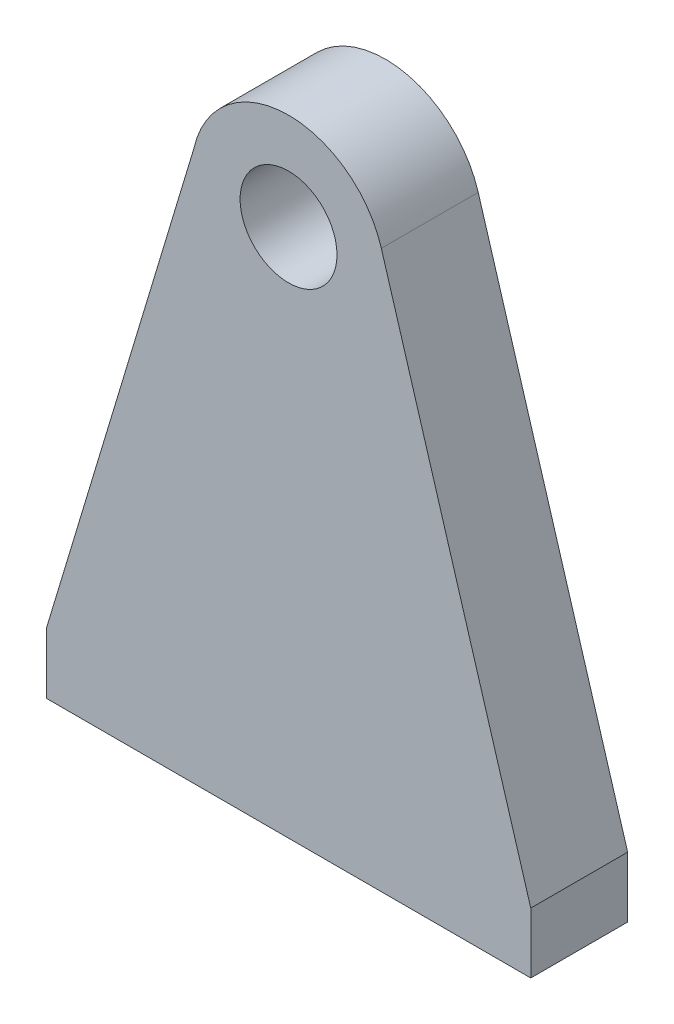
ISO-10303-21;
HEADER;
FILE_DESCRIPTION(('STEP AP214'),'2;1');
FILE_NAME('part.step','',(''),(''),'','','');
FILE_SCHEMA(('AUTOMOTIVE_DESIGN { 1 0 10303 214 1 1 1 1 }'));
ENDSEC;
DATA;
#1=APPLICATION_CONTEXT('core data for automotive mechanical design processes');
#2=APPLICATION_PROTOCOL_DEFINITION('international standard','automotive_design',2000,#1);
#3=PRODUCT_CONTEXT('',#1,'mechanical');
#4=PRODUCT('Part','Part','',(#3));
#5=PRODUCT_RELATED_PRODUCT_CATEGORY('part','',(#4));
#6=PRODUCT_DEFINITION_FORMATION('','',#4);
#7=PRODUCT_DEFINITION_CONTEXT('part definition',#1,'design');
#8=PRODUCT_DEFINITION('design','',#6,#7);
#9=PRODUCT_DEFINITION_SHAPE('','',#8);
#10=(LENGTH_UNIT() NAMED_UNIT(*) SI_UNIT(.MILLI.,.METRE.));
#11=(NAMED_UNIT(*) PLANE_ANGLE_UNIT() SI_UNIT($,.RADIAN.));
#12=(NAMED_UNIT(*) SI_UNIT($,.STERADIAN.) SOLID_ANGLE_UNIT());
#13=UNCERTAINTY_MEASURE_WITH_UNIT(LENGTH_MEASURE(1.E-05),#10,'distance_accuracy_value','');
#14=(GEOMETRIC_REPRESENTATION_CONTEXT(3) GLOBAL_UNCERTAINTY_ASSIGNED_CONTEXT((#13)) GLOBAL_UNIT_ASSIGNED_CONTEXT((#10,
#11,#12)) REPRESENTATION_CONTEXT('',''));
#15=CARTESIAN_POINT('',(0.,0.,0.));
#16=DIRECTION('',(0.,0.,1.));
#17=DIRECTION('',(1.,0.,0.));
#18=AXIS2_PLACEMENT_3D('',#15,#16,#17);
#19=CARTESIAN_POINT('',(-16.5786983985875,216.11316607204,40.));
#20=DIRECTION('',(0.,0.,1.));
#21=DIRECTION('',(1.,0.,0.));
#22=AXIS2_PLACEMENT_3D('',#19,#20,#21);
#23=PLANE('',#22);
#24=DIRECTION('',(-0.288644962462309,-0.957436204477944,0.));
#25=VECTOR('',#24,1.);
#26=CARTESIAN_POINT('',(-55.6490102421352,224.687006078008,40.));
#27=LINE('',#26,#25);
#28=CARTESIAN_POINT('',(-55.6490102421352,224.687006078008,40.));
#29=VERTEX_POINT('',#28);
#30=CARTESIAN_POINT('',(-116.578698398587,22.583048084437,40.));
#31=VERTEX_POINT('',#30);
#32=EDGE_CURVE('E146',#29,#31,#27,.T.);
#33=ORIENTED_EDGE('',*,*,#32,.T.);
#34=DIRECTION('',(0.,-1.,0.));
#35=VECTOR('',#34,1.);
#36=CARTESIAN_POINT('',(-116.578698398587,22.583048084437,40.));
#37=LINE('',#36,#35);
#38=CARTESIAN_POINT('',(-116.578698398587,-2.41695191556296,40.));
#39=VERTEX_POINT('',#38);
#40=EDGE_CURVE('E94',#31,#39,#37,.T.);
#41=ORIENTED_EDGE('',*,*,#40,.T.);
#42=DIRECTION('',(1.,0.,0.));
#43=VECTOR('',#42,1.);
#44=CARTESIAN_POINT('',(-116.578698398587,-2.41695191556296,40.));
#45=LINE('',#44,#43);
#46=CARTESIAN_POINT('',(83.4213016014125,-2.41695191556296,40.));
#47=VERTEX_POINT('',#46);
#48=EDGE_CURVE('E107',#39,#47,#45,.T.);
#49=ORIENTED_EDGE('',*,*,#48,.T.);
#50=DIRECTION('',(0.,1.,0.));
#51=VECTOR('',#50,1.);
#52=CARTESIAN_POINT('',(83.4213016014125,22.583048084437,40.));
#53=LINE('',#52,#51);
#54=CARTESIAN_POINT('',(83.4213016014125,22.583048084437,40.));
#55=VERTEX_POINT('',#54);
#56=EDGE_CURVE('E101',#47,#55,#53,.T.);
#57=ORIENTED_EDGE('',*,*,#56,.T.);
#58=DIRECTION('',(-0.28811791414262,0.957594939183633,0.));
#59=VECTOR('',#58,1.);
#60=CARTESIAN_POINT('',(21.7250991687578,227.637882637745,40.));
#61=LINE('',#60,#59);
#62=CARTESIAN_POINT('',(21.7250991687578,227.637882637745,40.));
#63=VERTEX_POINT('',#62);
#64=EDGE_CURVE('E105',#55,#63,#61,.T.);
#65=ORIENTED_EDGE('',*,*,#64,.T.);
#66=CARTESIAN_POINT('',(-16.5786983985875,216.11316607204,40.));
#67=DIRECTION('',(0.,0.,1.));
#68=DIRECTION('',(1.,0.,0.));
#69=AXIS2_PLACEMENT_3D('',#66,#67,#68);
#70=CIRCLE('',#69,40.);
#71=EDGE_CURVE('E57',#63,#29,#70,.T.);
#72=ORIENTED_EDGE('',*,*,#71,.T.);
#73=EDGE_LOOP('',(#33,#41,#49,#57,#65,#72));
#74=FACE_BOUND('',#73,.T.);
#75=CARTESIAN_POINT('',(-16.5786983985875,216.11316607204,40.));
#76=DIRECTION('',(0.,0.,1.));
#77=DIRECTION('',(1.,0.,0.));
#78=AXIS2_PLACEMENT_3D('',#75,#76,#77);
#79=CIRCLE('',#78,20.);
#80=CARTESIAN_POINT('',(3.4213016014125,216.11316607204,40.));
#81=VERTEX_POINT('',#80);
#82=EDGE_CURVE('E134',#81,#81,#79,.T.);
#83=ORIENTED_EDGE('',*,*,#82,.F.);
#84=EDGE_LOOP('',(#83));
#85=FACE_BOUND('',#84,.T.);
#86=ADVANCED_FACE('F39',(#74,#85),#23,.T.);
#87=CARTESIAN_POINT('',(-16.5786983985875,216.11316607204,0.));
#88=DIRECTION('',(0.,0.,1.));
#89=DIRECTION('',(1.,0.,0.));
#90=AXIS2_PLACEMENT_3D('',#87,#88,#89);
#91=PLANE('',#90);
#92=DIRECTION('',(-0.288644962462309,-0.957436204477944,0.));
#93=VECTOR('',#92,1.);
#94=CARTESIAN_POINT('',(-55.6490102421352,224.687006078008,0.));
#95=LINE('',#94,#93);
#96=CARTESIAN_POINT('',(-55.6490102421352,224.687006078008,0.));
#97=VERTEX_POINT('',#96);
#98=CARTESIAN_POINT('',(-116.578698398587,22.583048084437,0.));
#99=VERTEX_POINT('',#98);
#100=EDGE_CURVE('E129',#97,#99,#95,.T.);
#101=ORIENTED_EDGE('',*,*,#100,.F.);
#102=CARTESIAN_POINT('',(-16.5786983985875,216.11316607204,0.));
#103=DIRECTION('',(0.,0.,1.));
#104=DIRECTION('',(1.,0.,0.));
#105=AXIS2_PLACEMENT_3D('',#102,#103,#104);
#106=CIRCLE('',#105,40.);
#107=CARTESIAN_POINT('',(21.7250991687578,227.637882637745,0.));
#108=VERTEX_POINT('',#107);
#109=EDGE_CURVE('E86',#108,#97,#106,.T.);
#110=ORIENTED_EDGE('',*,*,#109,.F.);
#111=DIRECTION('',(-0.28811791414262,0.957594939183633,0.));
#112=VECTOR('',#111,1.);
#113=CARTESIAN_POINT('',(21.7250991687578,227.637882637745,0.));
#114=LINE('',#113,#112);
#115=CARTESIAN_POINT('',(83.4213016014125,22.583048084437,0.));
#116=VERTEX_POINT('',#115);
#117=EDGE_CURVE('E80',#116,#108,#114,.T.);
#118=ORIENTED_EDGE('',*,*,#117,.F.);
#119=DIRECTION('',(0.,1.,0.));
#120=VECTOR('',#119,1.);
#121=CARTESIAN_POINT('',(83.4213016014125,22.583048084437,0.));
#122=LINE('',#121,#120);
#123=CARTESIAN_POINT('',(83.4213016014125,-2.41695191556296,0.));
#124=VERTEX_POINT('',#123);
#125=EDGE_CURVE('E116',#124,#116,#122,.T.);
#126=ORIENTED_EDGE('',*,*,#125,.F.);
#127=DIRECTION('',(1.,0.,0.));
#128=VECTOR('',#127,1.);
#129=CARTESIAN_POINT('',(-116.578698398587,-2.41695191556296,0.));
#130=LINE('',#129,#128);
#131=CARTESIAN_POINT('',(-116.578698398587,-2.41695191556296,0.));
#132=VERTEX_POINT('',#131);
#133=EDGE_CURVE('E137',#132,#124,#130,.T.);
#134=ORIENTED_EDGE('',*,*,#133,.F.);
#135=DIRECTION('',(0.,-1.,0.));
#136=VECTOR('',#135,1.);
#137=CARTESIAN_POINT('',(-116.578698398587,22.583048084437,0.));
#138=LINE('',#137,#136);
#139=EDGE_CURVE('E133',#99,#132,#138,.T.);
#140=ORIENTED_EDGE('',*,*,#139,.F.);
#141=EDGE_LOOP('',(#101,#110,#118,#126,#134,#140));
#142=FACE_BOUND('',#141,.T.);
#143=CARTESIAN_POINT('',(-16.5786983985875,216.11316607204,0.));
#144=DIRECTION('',(0.,0.,1.));
#145=DIRECTION('',(1.,0.,0.));
#146=AXIS2_PLACEMENT_3D('',#143,#144,#145);
#147=CIRCLE('',#146,20.);
#148=CARTESIAN_POINT('',(3.4213016014125,216.11316607204,0.));
#149=VERTEX_POINT('',#148);
#150=EDGE_CURVE('E243',#149,#149,#147,.T.);
#151=ORIENTED_EDGE('',*,*,#150,.T.);
#152=EDGE_LOOP('',(#151));
#153=FACE_BOUND('',#152,.T.);
#154=ADVANCED_FACE('F159',(#142,#153),#91,.F.);
#155=CARTESIAN_POINT('',(-55.6490102421352,224.687006078008,40.));
#156=DIRECTION('',(0.957436204477944,-0.288644962462309,0.));
#157=DIRECTION('',(0.288644962462309,0.957436204477944,0.));
#158=AXIS2_PLACEMENT_3D('',#155,#156,#157);
#159=PLANE('',#158);
#160=ORIENTED_EDGE('',*,*,#100,.T.);
#161=DIRECTION('',(0.,0.,-1.));
#162=VECTOR('',#161,1.);
#163=CARTESIAN_POINT('',(-116.578698398587,22.583048084437,40.));
#164=LINE('',#163,#162);
#165=EDGE_CURVE('E11',#31,#99,#164,.T.);
#166=ORIENTED_EDGE('',*,*,#165,.F.);
#167=ORIENTED_EDGE('',*,*,#32,.F.);
#168=DIRECTION('',(0.,0.,-1.));
#169=VECTOR('',#168,1.);
#170=CARTESIAN_POINT('',(-55.6490102421352,224.687006078008,40.));
#171=LINE('',#170,#169);
#172=EDGE_CURVE('E125',#29,#97,#171,.T.);
#173=ORIENTED_EDGE('',*,*,#172,.T.);
#174=EDGE_LOOP('',(#160,#166,#167,#173));
#175=FACE_BOUND('',#174,.T.);
#176=ADVANCED_FACE('F41',(#175),#159,.F.);
#177=CARTESIAN_POINT('',(-116.578698398587,22.583048084437,40.));
#178=DIRECTION('',(1.,0.,0.));
#179=DIRECTION('',(0.,0.,-1.));
#180=AXIS2_PLACEMENT_3D('',#177,#178,#179);
#181=PLANE('',#180);
#182=ORIENTED_EDGE('',*,*,#139,.T.);
#183=DIRECTION('',(0.,0.,-1.));
#184=VECTOR('',#183,1.);
#185=CARTESIAN_POINT('',(-116.578698398587,-2.41695191556296,40.));
#186=LINE('',#185,#184);
#187=EDGE_CURVE('E49',#39,#132,#186,.T.);
#188=ORIENTED_EDGE('',*,*,#187,.F.);
#189=ORIENTED_EDGE('',*,*,#40,.F.);
#190=ORIENTED_EDGE('',*,*,#165,.T.);
#191=EDGE_LOOP('',(#182,#188,#189,#190));
#192=FACE_BOUND('',#191,.T.);
#193=ADVANCED_FACE('F184',(#192),#181,.F.);
#194=CARTESIAN_POINT('',(-116.578698398587,-2.41695191556296,40.));
#195=DIRECTION('',(0.,1.,0.));
#196=DIRECTION('',(0.,0.,1.));
#197=AXIS2_PLACEMENT_3D('',#194,#195,#196);
#198=PLANE('',#197);
#199=ORIENTED_EDGE('',*,*,#133,.T.);
#200=DIRECTION('',(0.,0.,-1.));
#201=VECTOR('',#200,1.);
#202=CARTESIAN_POINT('',(83.4213016014125,-2.41695191556296,40.));
#203=LINE('',#202,#201);
#204=EDGE_CURVE('E118',#47,#124,#203,.T.);
#205=ORIENTED_EDGE('',*,*,#204,.F.);
#206=ORIENTED_EDGE('',*,*,#48,.F.);
#207=ORIENTED_EDGE('',*,*,#187,.T.);
#208=EDGE_LOOP('',(#199,#205,#206,#207));
#209=FACE_BOUND('',#208,.T.);
#210=ADVANCED_FACE('F156',(#209),#198,.F.);
#211=CARTESIAN_POINT('',(83.4213016014125,22.583048084437,40.));
#212=DIRECTION('',(-1.,0.,0.));
#213=DIRECTION('',(0.,0.,1.));
#214=AXIS2_PLACEMENT_3D('',#211,#212,#213);
#215=PLANE('',#214);
#216=ORIENTED_EDGE('',*,*,#125,.T.);
#217=DIRECTION('',(0.,0.,-1.));
#218=VECTOR('',#217,1.);
#219=CARTESIAN_POINT('',(83.4213016014125,22.583048084437,40.));
#220=LINE('',#219,#218);
#221=EDGE_CURVE('E113',#55,#116,#220,.T.);
#222=ORIENTED_EDGE('',*,*,#221,.F.);
#223=ORIENTED_EDGE('',*,*,#56,.F.);
#224=ORIENTED_EDGE('',*,*,#204,.T.);
#225=EDGE_LOOP('',(#216,#222,#223,#224));
#226=FACE_BOUND('',#225,.T.);
#227=ADVANCED_FACE('F114',(#226),#215,.F.);
#228=CARTESIAN_POINT('',(21.7250991687578,227.637882637745,40.));
#229=DIRECTION('',(-0.957594939183633,-0.28811791414262,0.));
#230=DIRECTION('',(0.28811791414262,-0.957594939183633,0.));
#231=AXIS2_PLACEMENT_3D('',#228,#229,#230);
#232=PLANE('',#231);
#233=ORIENTED_EDGE('',*,*,#117,.T.);
#234=DIRECTION('',(0.,0.,-1.));
#235=VECTOR('',#234,1.);
#236=CARTESIAN_POINT('',(21.7250991687578,227.637882637745,40.));
#237=LINE('',#236,#235);
#238=EDGE_CURVE('E119',#63,#108,#237,.T.);
#239=ORIENTED_EDGE('',*,*,#238,.F.);
#240=ORIENTED_EDGE('',*,*,#64,.F.);
#241=ORIENTED_EDGE('',*,*,#221,.T.);
#242=EDGE_LOOP('',(#233,#239,#240,#241));
#243=FACE_BOUND('',#242,.T.);
#244=ADVANCED_FACE('F121',(#243),#232,.F.);
#245=CARTESIAN_POINT('',(-16.5786983985875,216.11316607204,40.));
#246=DIRECTION('',(0.,0.,-1.));
#247=DIRECTION('',(-1.,0.,0.));
#248=AXIS2_PLACEMENT_3D('',#245,#246,#247);
#249=CYLINDRICAL_SURFACE('',#248,40.);
#250=ORIENTED_EDGE('',*,*,#109,.T.);
#251=ORIENTED_EDGE('',*,*,#172,.F.);
#252=ORIENTED_EDGE('',*,*,#71,.F.);
#253=ORIENTED_EDGE('',*,*,#238,.T.);
#254=EDGE_LOOP('',(#250,#251,#252,#253));
#255=FACE_BOUND('',#254,.T.);
#256=ADVANCED_FACE('F164',(#255),#249,.T.);
#257=CARTESIAN_POINT('',(-16.5786983985875,216.11316607204,40.));
#258=DIRECTION('',(0.,0.,-1.));
#259=DIRECTION('',(-1.,0.,0.));
#260=AXIS2_PLACEMENT_3D('',#257,#258,#259);
#261=CYLINDRICAL_SURFACE('',#260,20.);
#262=ORIENTED_EDGE('',*,*,#82,.T.);
#263=EDGE_LOOP('',(#262));
#264=FACE_BOUND('',#263,.T.);
#265=ORIENTED_EDGE('',*,*,#150,.F.);
#266=EDGE_LOOP('',(#265));
#267=FACE_BOUND('',#266,.T.);
#268=ADVANCED_FACE('F166',(#264,#267),#261,.F.);
#269=CLOSED_SHELL('',(#86,#154,#176,#193,#210,#227,#244,#256,#268));
#270=MANIFOLD_SOLID_BREP('B2',#269);
#271=ADVANCED_BREP_SHAPE_REPRESENTATION('',(#18,#270),#14);
#272=SHAPE_DEFINITION_REPRESENTATION(#9,#271);
ENDSEC;
END-ISO-10303-21;
